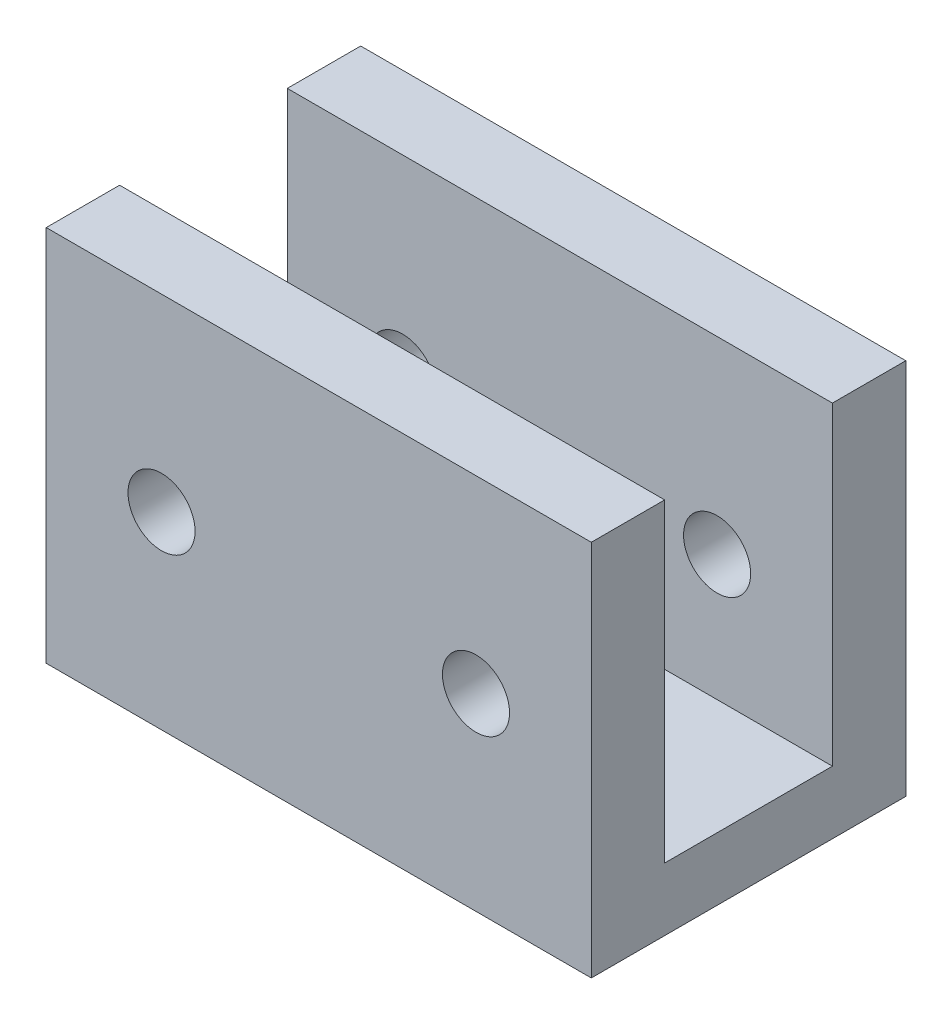
ISO-10303-21;
HEADER;
FILE_DESCRIPTION(('STEP AP214'),'2;1');
FILE_NAME('part.step','',(''),(''),'','','');
FILE_SCHEMA(('AUTOMOTIVE_DESIGN { 1 0 10303 214 1 1 1 1 }'));
ENDSEC;
DATA;
#1=APPLICATION_CONTEXT('core data for automotive mechanical design processes');
#2=APPLICATION_PROTOCOL_DEFINITION('international standard','automotive_design',2000,#1);
#3=PRODUCT_CONTEXT('',#1,'mechanical');
#4=PRODUCT('Part','Part','',(#3));
#5=PRODUCT_RELATED_PRODUCT_CATEGORY('part','',(#4));
#6=PRODUCT_DEFINITION_FORMATION('','',#4);
#7=PRODUCT_DEFINITION_CONTEXT('part definition',#1,'design');
#8=PRODUCT_DEFINITION('design','',#6,#7);
#9=PRODUCT_DEFINITION_SHAPE('','',#8);
#10=(LENGTH_UNIT() NAMED_UNIT(*) SI_UNIT(.MILLI.,.METRE.));
#11=(NAMED_UNIT(*) PLANE_ANGLE_UNIT() SI_UNIT($,.RADIAN.));
#12=(NAMED_UNIT(*) SI_UNIT($,.STERADIAN.) SOLID_ANGLE_UNIT());
#13=UNCERTAINTY_MEASURE_WITH_UNIT(LENGTH_MEASURE(1.E-05),#10,'distance_accuracy_value','');
#14=(GEOMETRIC_REPRESENTATION_CONTEXT(3) GLOBAL_UNCERTAINTY_ASSIGNED_CONTEXT((#13)) GLOBAL_UNIT_ASSIGNED_CONTEXT((#10,
#11,#12)) REPRESENTATION_CONTEXT('',''));
#15=CARTESIAN_POINT('',(0.,0.,0.));
#16=DIRECTION('',(0.,0.,1.));
#17=DIRECTION('',(1.,0.,0.));
#18=AXIS2_PLACEMENT_3D('',#15,#16,#17);
#19=CARTESIAN_POINT('',(-13.,9.,7.5));
#20=DIRECTION('',(0.,-1.,0.));
#21=DIRECTION('',(0.,0.,-1.));
#22=AXIS2_PLACEMENT_3D('',#19,#20,#21);
#23=PLANE('',#22);
#24=DIRECTION('',(0.,0.,-1.));
#25=VECTOR('',#24,1.);
#26=CARTESIAN_POINT('',(-13.,9.,7.5));
#27=LINE('',#26,#25);
#28=CARTESIAN_POINT('',(-13.,9.,-4.));
#29=VERTEX_POINT('',#28);
#30=CARTESIAN_POINT('',(-13.,9.,-7.5));
#31=VERTEX_POINT('',#30);
#32=EDGE_CURVE('E148',#29,#31,#27,.T.);
#33=ORIENTED_EDGE('',*,*,#32,.F.);
#34=DIRECTION('',(-1.,0.,0.));
#35=VECTOR('',#34,1.);
#36=CARTESIAN_POINT('',(17.,9.,-4.));
#37=LINE('',#36,#35);
#38=CARTESIAN_POINT('',(13.,9.,-4.));
#39=VERTEX_POINT('',#38);
#40=EDGE_CURVE('E142',#39,#29,#37,.T.);
#41=ORIENTED_EDGE('',*,*,#40,.F.);
#42=DIRECTION('',(0.,0.,-1.));
#43=VECTOR('',#42,1.);
#44=CARTESIAN_POINT('',(13.,9.,7.5));
#45=LINE('',#44,#43);
#46=CARTESIAN_POINT('',(13.,9.,-7.5));
#47=VERTEX_POINT('',#46);
#48=EDGE_CURVE('E59',#39,#47,#45,.T.);
#49=ORIENTED_EDGE('',*,*,#48,.T.);
#50=DIRECTION('',(-1.,0.,0.));
#51=VECTOR('',#50,1.);
#52=CARTESIAN_POINT('',(-13.,9.,-7.5));
#53=LINE('',#52,#51);
#54=EDGE_CURVE('E223',#47,#31,#53,.T.);
#55=ORIENTED_EDGE('',*,*,#54,.T.);
#56=EDGE_LOOP('',(#33,#41,#49,#55));
#57=FACE_BOUND('',#56,.T.);
#58=ADVANCED_FACE('F49',(#57),#23,.F.);
#59=CARTESIAN_POINT('',(-7.5,0.,7.5));
#60=DIRECTION('',(0.,0.,-1.));
#61=DIRECTION('',(-1.,0.,0.));
#62=AXIS2_PLACEMENT_3D('',#59,#60,#61);
#63=CYLINDRICAL_SURFACE('',#62,1.6);
#64=CARTESIAN_POINT('',(-7.5,0.,-4.));
#65=DIRECTION('',(0.,0.,-1.));
#66=DIRECTION('',(-1.,0.,0.));
#67=AXIS2_PLACEMENT_3D('',#64,#65,#66);
#68=CIRCLE('',#67,1.6);
#69=CARTESIAN_POINT('',(-9.1,0.,-4.));
#70=VERTEX_POINT('',#69);
#71=EDGE_CURVE('E181',#70,#70,#68,.T.);
#72=ORIENTED_EDGE('',*,*,#71,.F.);
#73=EDGE_LOOP('',(#72));
#74=FACE_BOUND('',#73,.T.);
#75=CARTESIAN_POINT('',(-7.5,0.,-7.5));
#76=DIRECTION('',(0.,0.,1.));
#77=DIRECTION('',(1.,0.,0.));
#78=AXIS2_PLACEMENT_3D('',#75,#76,#77);
#79=CIRCLE('',#78,1.6);
#80=CARTESIAN_POINT('',(-5.9,0.,-7.5));
#81=VERTEX_POINT('',#80);
#82=EDGE_CURVE('E198',#81,#81,#79,.T.);
#83=ORIENTED_EDGE('',*,*,#82,.F.);
#84=EDGE_LOOP('',(#83));
#85=FACE_BOUND('',#84,.T.);
#86=ADVANCED_FACE('F290',(#74,#85),#63,.F.);
#87=CARTESIAN_POINT('',(7.5,0.,7.5));
#88=DIRECTION('',(0.,0.,-1.));
#89=DIRECTION('',(-1.,0.,0.));
#90=AXIS2_PLACEMENT_3D('',#87,#88,#89);
#91=CYLINDRICAL_SURFACE('',#90,1.6);
#92=CARTESIAN_POINT('',(7.5,0.,-4.));
#93=DIRECTION('',(0.,0.,-1.));
#94=DIRECTION('',(-1.,0.,0.));
#95=AXIS2_PLACEMENT_3D('',#92,#93,#94);
#96=CIRCLE('',#95,1.6);
#97=CARTESIAN_POINT('',(5.9,0.,-4.));
#98=VERTEX_POINT('',#97);
#99=EDGE_CURVE('E53',#98,#98,#96,.T.);
#100=ORIENTED_EDGE('',*,*,#99,.F.);
#101=EDGE_LOOP('',(#100));
#102=FACE_BOUND('',#101,.T.);
#103=CARTESIAN_POINT('',(7.5,0.,-7.5));
#104=DIRECTION('',(0.,0.,1.));
#105=DIRECTION('',(-1.,0.,0.));
#106=AXIS2_PLACEMENT_3D('',#103,#104,#105);
#107=CIRCLE('',#106,1.6);
#108=CARTESIAN_POINT('',(5.9,0.,-7.5));
#109=VERTEX_POINT('',#108);
#110=EDGE_CURVE('E193',#109,#109,#107,.T.);
#111=ORIENTED_EDGE('',*,*,#110,.F.);
#112=EDGE_LOOP('',(#111));
#113=FACE_BOUND('',#112,.T.);
#114=ADVANCED_FACE('F286',(#102,#113),#91,.F.);
#115=CARTESIAN_POINT('',(0.,0.,7.5));
#116=DIRECTION('',(0.,0.,-1.));
#117=DIRECTION('',(-1.,0.,0.));
#118=AXIS2_PLACEMENT_3D('',#115,#116,#117);
#119=PLANE('',#118);
#120=DIRECTION('',(0.,1.,0.));
#121=VECTOR('',#120,1.);
#122=CARTESIAN_POINT('',(13.,-9.,7.5));
#123=LINE('',#122,#121);
#124=CARTESIAN_POINT('',(13.,-9.,7.5));
#125=VERTEX_POINT('',#124);
#126=CARTESIAN_POINT('',(13.,9.,7.5));
#127=VERTEX_POINT('',#126);
#128=EDGE_CURVE('E210',#125,#127,#123,.T.);
#129=ORIENTED_EDGE('',*,*,#128,.T.);
#130=DIRECTION('',(-1.,0.,0.));
#131=VECTOR('',#130,1.);
#132=CARTESIAN_POINT('',(-13.,9.,7.5));
#133=LINE('',#132,#131);
#134=CARTESIAN_POINT('',(-13.,9.,7.5));
#135=VERTEX_POINT('',#134);
#136=EDGE_CURVE('E104',#127,#135,#133,.T.);
#137=ORIENTED_EDGE('',*,*,#136,.T.);
#138=DIRECTION('',(0.,-1.,0.));
#139=VECTOR('',#138,1.);
#140=CARTESIAN_POINT('',(-13.,-9.,7.5));
#141=LINE('',#140,#139);
#142=CARTESIAN_POINT('',(-13.,-9.,7.5));
#143=VERTEX_POINT('',#142);
#144=EDGE_CURVE('E146',#135,#143,#141,.T.);
#145=ORIENTED_EDGE('',*,*,#144,.T.);
#146=DIRECTION('',(1.,0.,0.));
#147=VECTOR('',#146,1.);
#148=CARTESIAN_POINT('',(-13.,-9.,7.5));
#149=LINE('',#148,#147);
#150=EDGE_CURVE('E76',#143,#125,#149,.T.);
#151=ORIENTED_EDGE('',*,*,#150,.T.);
#152=EDGE_LOOP('',(#129,#137,#145,#151));
#153=FACE_BOUND('',#152,.T.);
#154=CARTESIAN_POINT('',(-7.5,0.,7.5));
#155=DIRECTION('',(0.,0.,1.));
#156=DIRECTION('',(1.,0.,0.));
#157=AXIS2_PLACEMENT_3D('',#154,#155,#156);
#158=CIRCLE('',#157,1.6);
#159=CARTESIAN_POINT('',(-5.9,0.,7.5));
#160=VERTEX_POINT('',#159);
#161=EDGE_CURVE('E202',#160,#160,#158,.T.);
#162=ORIENTED_EDGE('',*,*,#161,.F.);
#163=EDGE_LOOP('',(#162));
#164=FACE_BOUND('',#163,.T.);
#165=CARTESIAN_POINT('',(7.5,0.,7.5));
#166=DIRECTION('',(0.,0.,1.));
#167=DIRECTION('',(-1.,0.,0.));
#168=AXIS2_PLACEMENT_3D('',#165,#166,#167);
#169=CIRCLE('',#168,1.6);
#170=CARTESIAN_POINT('',(5.9,0.,7.5));
#171=VERTEX_POINT('',#170);
#172=EDGE_CURVE('E194',#171,#171,#169,.T.);
#173=ORIENTED_EDGE('',*,*,#172,.F.);
#174=EDGE_LOOP('',(#173));
#175=FACE_BOUND('',#174,.T.);
#176=ADVANCED_FACE('F289',(#153,#164,#175),#119,.F.);
#177=CARTESIAN_POINT('',(0.,0.,-7.5));
#178=DIRECTION('',(0.,0.,-1.));
#179=DIRECTION('',(-1.,0.,0.));
#180=AXIS2_PLACEMENT_3D('',#177,#178,#179);
#181=PLANE('',#180);
#182=ORIENTED_EDGE('',*,*,#82,.T.);
#183=EDGE_LOOP('',(#182));
#184=FACE_BOUND('',#183,.T.);
#185=DIRECTION('',(0.,1.,0.));
#186=VECTOR('',#185,1.);
#187=CARTESIAN_POINT('',(13.,-9.,-7.5));
#188=LINE('',#187,#186);
#189=CARTESIAN_POINT('',(13.,-9.,-7.5));
#190=VERTEX_POINT('',#189);
#191=EDGE_CURVE('E206',#190,#47,#188,.T.);
#192=ORIENTED_EDGE('',*,*,#191,.F.);
#193=DIRECTION('',(1.,0.,0.));
#194=VECTOR('',#193,1.);
#195=CARTESIAN_POINT('',(-13.,-9.,-7.5));
#196=LINE('',#195,#194);
#197=CARTESIAN_POINT('',(-13.,-9.,-7.5));
#198=VERTEX_POINT('',#197);
#199=EDGE_CURVE('E97',#198,#190,#196,.T.);
#200=ORIENTED_EDGE('',*,*,#199,.F.);
#201=DIRECTION('',(0.,-1.,0.));
#202=VECTOR('',#201,1.);
#203=CARTESIAN_POINT('',(-13.,-9.,-7.5));
#204=LINE('',#203,#202);
#205=EDGE_CURVE('E227',#31,#198,#204,.T.);
#206=ORIENTED_EDGE('',*,*,#205,.F.);
#207=ORIENTED_EDGE('',*,*,#54,.F.);
#208=EDGE_LOOP('',(#192,#200,#206,#207));
#209=FACE_BOUND('',#208,.T.);
#210=ORIENTED_EDGE('',*,*,#110,.T.);
#211=EDGE_LOOP('',(#210));
#212=FACE_BOUND('',#211,.T.);
#213=ADVANCED_FACE('F241',(#184,#209,#212),#181,.T.);
#214=CARTESIAN_POINT('',(13.,-9.,7.5));
#215=DIRECTION('',(-1.,0.,0.));
#216=DIRECTION('',(0.,-1.,0.));
#217=AXIS2_PLACEMENT_3D('',#214,#215,#216);
#218=PLANE('',#217);
#219=ORIENTED_EDGE('',*,*,#48,.F.);
#220=DIRECTION('',(0.,-1.,0.));
#221=VECTOR('',#220,1.);
#222=CARTESIAN_POINT('',(13.,-9.,-4.));
#223=LINE('',#222,#221);
#224=CARTESIAN_POINT('',(13.,-6.,-4.));
#225=VERTEX_POINT('',#224);
#226=EDGE_CURVE('E185',#39,#225,#223,.T.);
#227=ORIENTED_EDGE('',*,*,#226,.T.);
#228=DIRECTION('',(0.,0.,1.));
#229=VECTOR('',#228,1.);
#230=CARTESIAN_POINT('',(13.,-6.,7.5));
#231=LINE('',#230,#229);
#232=CARTESIAN_POINT('',(13.,-6.,4.));
#233=VERTEX_POINT('',#232);
#234=EDGE_CURVE('E189',#225,#233,#231,.T.);
#235=ORIENTED_EDGE('',*,*,#234,.T.);
#236=DIRECTION('',(0.,1.,0.));
#237=VECTOR('',#236,1.);
#238=CARTESIAN_POINT('',(13.,-9.,4.));
#239=LINE('',#238,#237);
#240=CARTESIAN_POINT('',(13.,9.,4.));
#241=VERTEX_POINT('',#240);
#242=EDGE_CURVE('E168',#233,#241,#239,.T.);
#243=ORIENTED_EDGE('',*,*,#242,.T.);
#244=EDGE_CURVE('E11',#127,#241,#45,.T.);
#245=ORIENTED_EDGE('',*,*,#244,.F.);
#246=ORIENTED_EDGE('',*,*,#128,.F.);
#247=DIRECTION('',(0.,0.,-1.));
#248=VECTOR('',#247,1.);
#249=CARTESIAN_POINT('',(13.,-9.,7.5));
#250=LINE('',#249,#248);
#251=EDGE_CURVE('E219',#125,#190,#250,.T.);
#252=ORIENTED_EDGE('',*,*,#251,.T.);
#253=ORIENTED_EDGE('',*,*,#191,.T.);
#254=EDGE_LOOP('',(#219,#227,#235,#243,#245,#246,#252,#253));
#255=FACE_BOUND('',#254,.T.);
#256=ADVANCED_FACE('F51',(#255),#218,.F.);
#257=ORIENTED_EDGE('',*,*,#244,.T.);
#258=DIRECTION('',(-1.,0.,0.));
#259=VECTOR('',#258,1.);
#260=CARTESIAN_POINT('',(17.,9.,4.));
#261=LINE('',#260,#259);
#262=CARTESIAN_POINT('',(-13.,9.,4.));
#263=VERTEX_POINT('',#262);
#264=EDGE_CURVE('E129',#241,#263,#261,.T.);
#265=ORIENTED_EDGE('',*,*,#264,.T.);
#266=EDGE_CURVE('E138',#135,#263,#27,.T.);
#267=ORIENTED_EDGE('',*,*,#266,.F.);
#268=ORIENTED_EDGE('',*,*,#136,.F.);
#269=EDGE_LOOP('',(#257,#265,#267,#268));
#270=FACE_BOUND('',#269,.T.);
#271=ADVANCED_FACE('F137',(#270),#23,.F.);
#272=CARTESIAN_POINT('',(-13.,-9.,7.5));
#273=DIRECTION('',(1.,0.,0.));
#274=DIRECTION('',(0.,0.,-1.));
#275=AXIS2_PLACEMENT_3D('',#272,#273,#274);
#276=PLANE('',#275);
#277=DIRECTION('',(0.,0.,1.));
#278=VECTOR('',#277,1.);
#279=CARTESIAN_POINT('',(-13.,-6.,-4.));
#280=LINE('',#279,#278);
#281=CARTESIAN_POINT('',(-13.,-6.,-4.));
#282=VERTEX_POINT('',#281);
#283=CARTESIAN_POINT('',(-13.,-6.,4.));
#284=VERTEX_POINT('',#283);
#285=EDGE_CURVE('E67',#282,#284,#280,.T.);
#286=ORIENTED_EDGE('',*,*,#285,.F.);
#287=DIRECTION('',(0.,-1.,0.));
#288=VECTOR('',#287,1.);
#289=CARTESIAN_POINT('',(-13.,-6.,-4.));
#290=LINE('',#289,#288);
#291=EDGE_CURVE('E135',#29,#282,#290,.T.);
#292=ORIENTED_EDGE('',*,*,#291,.F.);
#293=ORIENTED_EDGE('',*,*,#32,.T.);
#294=ORIENTED_EDGE('',*,*,#205,.T.);
#295=DIRECTION('',(0.,0.,-1.));
#296=VECTOR('',#295,1.);
#297=CARTESIAN_POINT('',(-13.,-9.,7.5));
#298=LINE('',#297,#296);
#299=EDGE_CURVE('E154',#143,#198,#298,.T.);
#300=ORIENTED_EDGE('',*,*,#299,.F.);
#301=ORIENTED_EDGE('',*,*,#144,.F.);
#302=ORIENTED_EDGE('',*,*,#266,.T.);
#303=DIRECTION('',(0.,1.,0.));
#304=VECTOR('',#303,1.);
#305=CARTESIAN_POINT('',(-13.,-6.,4.));
#306=LINE('',#305,#304);
#307=EDGE_CURVE('E126',#284,#263,#306,.T.);
#308=ORIENTED_EDGE('',*,*,#307,.F.);
#309=EDGE_LOOP('',(#286,#292,#293,#294,#300,#301,#302,#308));
#310=FACE_BOUND('',#309,.T.);
#311=ADVANCED_FACE('F144',(#310),#276,.F.);
#312=CARTESIAN_POINT('',(-13.,-9.,7.5));
#313=DIRECTION('',(0.,1.,0.));
#314=DIRECTION('',(0.,0.,1.));
#315=AXIS2_PLACEMENT_3D('',#312,#313,#314);
#316=PLANE('',#315);
#317=ORIENTED_EDGE('',*,*,#199,.T.);
#318=ORIENTED_EDGE('',*,*,#251,.F.);
#319=ORIENTED_EDGE('',*,*,#150,.F.);
#320=ORIENTED_EDGE('',*,*,#299,.T.);
#321=EDGE_LOOP('',(#317,#318,#319,#320));
#322=FACE_BOUND('',#321,.T.);
#323=ADVANCED_FACE('F238',(#322),#316,.F.);
#324=CARTESIAN_POINT('',(-7.5,0.,4.));
#325=DIRECTION('',(0.,0.,1.));
#326=DIRECTION('',(1.,0.,0.));
#327=AXIS2_PLACEMENT_3D('',#324,#325,#326);
#328=CIRCLE('',#327,1.6);
#329=CARTESIAN_POINT('',(-5.9,0.,4.));
#330=VERTEX_POINT('',#329);
#331=EDGE_CURVE('E160',#330,#330,#328,.T.);
#332=ORIENTED_EDGE('',*,*,#331,.F.);
#333=EDGE_LOOP('',(#332));
#334=FACE_BOUND('',#333,.T.);
#335=ORIENTED_EDGE('',*,*,#161,.T.);
#336=EDGE_LOOP('',(#335));
#337=FACE_BOUND('',#336,.T.);
#338=ADVANCED_FACE('F307',(#334,#337),#63,.F.);
#339=CARTESIAN_POINT('',(7.5,0.,4.));
#340=DIRECTION('',(0.,0.,1.));
#341=DIRECTION('',(1.,0.,0.));
#342=AXIS2_PLACEMENT_3D('',#339,#340,#341);
#343=CIRCLE('',#342,1.6);
#344=CARTESIAN_POINT('',(9.1,0.,4.));
#345=VERTEX_POINT('',#344);
#346=EDGE_CURVE('E157',#345,#345,#343,.T.);
#347=ORIENTED_EDGE('',*,*,#346,.F.);
#348=EDGE_LOOP('',(#347));
#349=FACE_BOUND('',#348,.T.);
#350=ORIENTED_EDGE('',*,*,#172,.T.);
#351=EDGE_LOOP('',(#350));
#352=FACE_BOUND('',#351,.T.);
#353=ADVANCED_FACE('F292',(#349,#352),#91,.F.);
#354=CARTESIAN_POINT('',(17.,-6.,-4.));
#355=DIRECTION('',(0.,-1.,0.));
#356=DIRECTION('',(0.,0.,-1.));
#357=AXIS2_PLACEMENT_3D('',#354,#355,#356);
#358=PLANE('',#357);
#359=DIRECTION('',(-1.,0.,0.));
#360=VECTOR('',#359,1.);
#361=CARTESIAN_POINT('',(17.,-6.,-4.));
#362=LINE('',#361,#360);
#363=EDGE_CURVE('E161',#225,#282,#362,.T.);
#364=ORIENTED_EDGE('',*,*,#363,.T.);
#365=ORIENTED_EDGE('',*,*,#285,.T.);
#366=DIRECTION('',(-1.,0.,0.));
#367=VECTOR('',#366,1.);
#368=CARTESIAN_POINT('',(17.,-6.,4.));
#369=LINE('',#368,#367);
#370=EDGE_CURVE('E131',#233,#284,#369,.T.);
#371=ORIENTED_EDGE('',*,*,#370,.F.);
#372=ORIENTED_EDGE('',*,*,#234,.F.);
#373=EDGE_LOOP('',(#364,#365,#371,#372));
#374=FACE_BOUND('',#373,.T.);
#375=ADVANCED_FACE('F319',(#374),#358,.F.);
#376=CARTESIAN_POINT('',(17.,-6.,-4.));
#377=DIRECTION('',(0.,0.,-1.));
#378=DIRECTION('',(-1.,0.,0.));
#379=AXIS2_PLACEMENT_3D('',#376,#377,#378);
#380=PLANE('',#379);
#381=ORIENTED_EDGE('',*,*,#71,.T.);
#382=EDGE_LOOP('',(#381));
#383=FACE_BOUND('',#382,.T.);
#384=ORIENTED_EDGE('',*,*,#99,.T.);
#385=EDGE_LOOP('',(#384));
#386=FACE_BOUND('',#385,.T.);
#387=ORIENTED_EDGE('',*,*,#40,.T.);
#388=ORIENTED_EDGE('',*,*,#291,.T.);
#389=ORIENTED_EDGE('',*,*,#363,.F.);
#390=ORIENTED_EDGE('',*,*,#226,.F.);
#391=EDGE_LOOP('',(#387,#388,#389,#390));
#392=FACE_BOUND('',#391,.T.);
#393=ADVANCED_FACE('F250',(#383,#386,#392),#380,.F.);
#394=CARTESIAN_POINT('',(17.,-6.,4.));
#395=DIRECTION('',(0.,0.,1.));
#396=DIRECTION('',(1.,0.,0.));
#397=AXIS2_PLACEMENT_3D('',#394,#395,#396);
#398=PLANE('',#397);
#399=ORIENTED_EDGE('',*,*,#331,.T.);
#400=EDGE_LOOP('',(#399));
#401=FACE_BOUND('',#400,.T.);
#402=ORIENTED_EDGE('',*,*,#346,.T.);
#403=EDGE_LOOP('',(#402));
#404=FACE_BOUND('',#403,.T.);
#405=ORIENTED_EDGE('',*,*,#370,.T.);
#406=ORIENTED_EDGE('',*,*,#307,.T.);
#407=ORIENTED_EDGE('',*,*,#264,.F.);
#408=ORIENTED_EDGE('',*,*,#242,.F.);
#409=EDGE_LOOP('',(#405,#406,#407,#408));
#410=FACE_BOUND('',#409,.T.);
#411=ADVANCED_FACE('F128',(#401,#404,#410),#398,.F.);
#412=CLOSED_SHELL('',(#58,#86,#114,#176,#213,#256,#271,#311,#323,#338,#353,#375,#393,#411));
#413=MANIFOLD_SOLID_BREP('B2',#412);
#414=ADVANCED_BREP_SHAPE_REPRESENTATION('',(#18,#413),#14);
#415=SHAPE_DEFINITION_REPRESENTATION(#9,#414);
ENDSEC;
END-ISO-10303-21;
